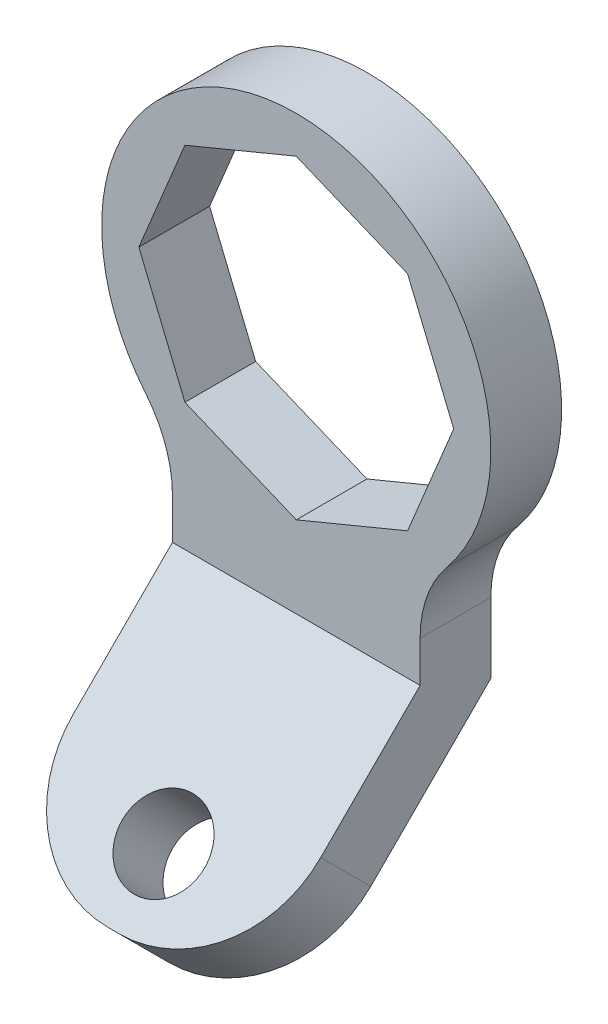
ISO-10303-21;
HEADER;
FILE_DESCRIPTION(('STEP AP214'),'2;1');
FILE_NAME('part.step','',(''),(''),'','','');
FILE_SCHEMA(('AUTOMOTIVE_DESIGN { 1 0 10303 214 1 1 1 1 }'));
ENDSEC;
DATA;
#1=APPLICATION_CONTEXT('core data for automotive mechanical design processes');
#2=APPLICATION_PROTOCOL_DEFINITION('international standard','automotive_design',2000,#1);
#3=PRODUCT_CONTEXT('',#1,'mechanical');
#4=PRODUCT('Part','Part','',(#3));
#5=PRODUCT_RELATED_PRODUCT_CATEGORY('part','',(#4));
#6=PRODUCT_DEFINITION_FORMATION('','',#4);
#7=PRODUCT_DEFINITION_CONTEXT('part definition',#1,'design');
#8=PRODUCT_DEFINITION('design','',#6,#7);
#9=PRODUCT_DEFINITION_SHAPE('','',#8);
#10=(LENGTH_UNIT() NAMED_UNIT(*) SI_UNIT(.MILLI.,.METRE.));
#11=(NAMED_UNIT(*) PLANE_ANGLE_UNIT() SI_UNIT($,.RADIAN.));
#12=(NAMED_UNIT(*) SI_UNIT($,.STERADIAN.) SOLID_ANGLE_UNIT());
#13=UNCERTAINTY_MEASURE_WITH_UNIT(LENGTH_MEASURE(1.E-05),#10,'distance_accuracy_value','');
#14=(GEOMETRIC_REPRESENTATION_CONTEXT(3) GLOBAL_UNCERTAINTY_ASSIGNED_CONTEXT((#13)) GLOBAL_UNIT_ASSIGNED_CONTEXT((#10,
#11,#12)) REPRESENTATION_CONTEXT('',''));
#15=CARTESIAN_POINT('',(0.,0.,0.));
#16=DIRECTION('',(0.,0.,1.));
#17=DIRECTION('',(1.,0.,0.));
#18=AXIS2_PLACEMENT_3D('',#15,#16,#17);
#19=CARTESIAN_POINT('',(0.,0.,6.));
#20=DIRECTION('',(0.,0.,1.));
#21=DIRECTION('',(1.,0.,0.));
#22=AXIS2_PLACEMENT_3D('',#19,#20,#21);
#23=PLANE('',#22);
#24=DIRECTION('',(0.923879532511287,-0.38268343236509,0.));
#25=VECTOR('',#24,1.);
#26=CARTESIAN_POINT('',(0.,13.35,6.));
#27=LINE('',#26,#25);
#28=CARTESIAN_POINT('',(0.,13.35,6.));
#29=VERTEX_POINT('',#28);
#30=CARTESIAN_POINT('',(9.43987552884041,9.43987552884041,6.));
#31=VERTEX_POINT('',#30);
#32=EDGE_CURVE('E232',#29,#31,#27,.T.);
#33=ORIENTED_EDGE('',*,*,#32,.T.);
#34=DIRECTION('',(0.38268343236509,-0.923879532511287,0.));
#35=VECTOR('',#34,1.);
#36=CARTESIAN_POINT('',(9.43987552884041,9.43987552884041,6.));
#37=LINE('',#36,#35);
#38=CARTESIAN_POINT('',(13.35,0.,6.));
#39=VERTEX_POINT('',#38);
#40=EDGE_CURVE('E238',#31,#39,#37,.T.);
#41=ORIENTED_EDGE('',*,*,#40,.T.);
#42=DIRECTION('',(-0.38268343236509,-0.923879532511287,0.));
#43=VECTOR('',#42,1.);
#44=CARTESIAN_POINT('',(13.35,0.,6.));
#45=LINE('',#44,#43);
#46=CARTESIAN_POINT('',(9.43987552884041,-9.43987552884041,6.));
#47=VERTEX_POINT('',#46);
#48=EDGE_CURVE('E245',#39,#47,#45,.T.);
#49=ORIENTED_EDGE('',*,*,#48,.T.);
#50=DIRECTION('',(-0.923879532511287,-0.38268343236509,0.));
#51=VECTOR('',#50,1.);
#52=CARTESIAN_POINT('',(9.43987552884041,-9.43987552884041,6.));
#53=LINE('',#52,#51);
#54=CARTESIAN_POINT('',(0.,-13.35,6.));
#55=VERTEX_POINT('',#54);
#56=EDGE_CURVE('E244',#47,#55,#53,.T.);
#57=ORIENTED_EDGE('',*,*,#56,.T.);
#58=DIRECTION('',(-0.923879532511287,0.38268343236509,0.));
#59=VECTOR('',#58,1.);
#60=CARTESIAN_POINT('',(0.,-13.35,6.));
#61=LINE('',#60,#59);
#62=CARTESIAN_POINT('',(-9.43987552884041,-9.43987552884041,6.));
#63=VERTEX_POINT('',#62);
#64=EDGE_CURVE('E247',#55,#63,#61,.T.);
#65=ORIENTED_EDGE('',*,*,#64,.T.);
#66=DIRECTION('',(-0.38268343236509,0.923879532511287,0.));
#67=VECTOR('',#66,1.);
#68=CARTESIAN_POINT('',(-9.43987552884041,-9.43987552884041,6.));
#69=LINE('',#68,#67);
#70=CARTESIAN_POINT('',(-13.35,0.,6.));
#71=VERTEX_POINT('',#70);
#72=EDGE_CURVE('E252',#63,#71,#69,.T.);
#73=ORIENTED_EDGE('',*,*,#72,.T.);
#74=DIRECTION('',(0.38268343236509,0.923879532511287,0.));
#75=VECTOR('',#74,1.);
#76=CARTESIAN_POINT('',(-13.35,0.,6.));
#77=LINE('',#76,#75);
#78=CARTESIAN_POINT('',(-9.43987552884041,9.43987552884041,6.));
#79=VERTEX_POINT('',#78);
#80=EDGE_CURVE('E251',#71,#79,#77,.T.);
#81=ORIENTED_EDGE('',*,*,#80,.T.);
#82=DIRECTION('',(0.923879532511287,0.38268343236509,0.));
#83=VECTOR('',#82,1.);
#84=CARTESIAN_POINT('',(-9.43987552884041,9.43987552884041,6.));
#85=LINE('',#84,#83);
#86=EDGE_CURVE('E260',#79,#29,#85,.T.);
#87=ORIENTED_EDGE('',*,*,#86,.T.);
#88=EDGE_LOOP('',(#33,#41,#49,#57,#65,#73,#81,#87));
#89=FACE_BOUND('',#88,.T.);
#90=DIRECTION('',(0.,1.,0.));
#91=VECTOR('',#90,1.);
#92=CARTESIAN_POINT('',(-10.5,0.,6.));
#93=LINE('',#92,#91);
#94=CARTESIAN_POINT('',(-10.5,-20.2573593128806,6.));
#95=VERTEX_POINT('',#94);
#96=CARTESIAN_POINT('',(-10.5,-16.7928556237467,6.));
#97=VERTEX_POINT('',#96);
#98=EDGE_CURVE('E228',#95,#97,#93,.T.);
#99=ORIENTED_EDGE('',*,*,#98,.F.);
#100=DIRECTION('',(1.,0.,0.));
#101=VECTOR('',#100,1.);
#102=CARTESIAN_POINT('',(-15.7928932188136,-20.2573593128806,6.));
#103=LINE('',#102,#101);
#104=CARTESIAN_POINT('',(10.5,-20.2573593128806,6.));
#105=VERTEX_POINT('',#104);
#106=EDGE_CURVE('E218',#95,#105,#103,.T.);
#107=ORIENTED_EDGE('',*,*,#106,.T.);
#108=DIRECTION('',(0.,1.,0.));
#109=VECTOR('',#108,1.);
#110=CARTESIAN_POINT('',(10.5,0.,6.));
#111=LINE('',#110,#109);
#112=CARTESIAN_POINT('',(10.5,-16.7928556237467,6.));
#113=VERTEX_POINT('',#112);
#114=EDGE_CURVE('E229',#105,#113,#111,.T.);
#115=ORIENTED_EDGE('',*,*,#114,.T.);
#116=CARTESIAN_POINT('',(20.5,-16.7928556237467,6.));
#117=DIRECTION('',(0.,0.,1.));
#118=DIRECTION('',(1.,0.,0.));
#119=AXIS2_PLACEMENT_3D('',#116,#117,#118);
#120=CIRCLE('',#119,10.);
#121=CARTESIAN_POINT('',(12.7641509433962,-10.4559289732762,6.));
#122=VERTEX_POINT('',#121);
#123=EDGE_CURVE('E328',#113,#122,#120,.F.);
#124=ORIENTED_EDGE('',*,*,#123,.T.);
#125=CARTESIAN_POINT('',(0.,0.,6.));
#126=DIRECTION('',(0.,0.,1.));
#127=DIRECTION('',(1.,0.,0.));
#128=AXIS2_PLACEMENT_3D('',#125,#126,#127);
#129=CIRCLE('',#128,16.5);
#130=CARTESIAN_POINT('',(-12.7641509433962,-10.4559289732762,6.));
#131=VERTEX_POINT('',#130);
#132=EDGE_CURVE('E300',#122,#131,#129,.T.);
#133=ORIENTED_EDGE('',*,*,#132,.T.);
#134=CARTESIAN_POINT('',(-20.5,-16.7928556237467,6.));
#135=DIRECTION('',(0.,0.,1.));
#136=DIRECTION('',(1.,0.,0.));
#137=AXIS2_PLACEMENT_3D('',#134,#135,#136);
#138=CIRCLE('',#137,10.);
#139=EDGE_CURVE('E78',#131,#97,#138,.F.);
#140=ORIENTED_EDGE('',*,*,#139,.T.);
#141=EDGE_LOOP('',(#99,#107,#115,#124,#133,#140));
#142=FACE_BOUND('',#141,.T.);
#143=ADVANCED_FACE('F74',(#89,#142),#23,.T.);
#144=CARTESIAN_POINT('',(0.,0.,0.));
#145=DIRECTION('',(0.,0.,1.));
#146=DIRECTION('',(1.,0.,0.));
#147=AXIS2_PLACEMENT_3D('',#144,#145,#146);
#148=PLANE('',#147);
#149=DIRECTION('',(0.38268343236509,-0.923879532511287,0.));
#150=VECTOR('',#149,1.);
#151=CARTESIAN_POINT('',(9.43987552884041,9.43987552884041,0.));
#152=LINE('',#151,#150);
#153=CARTESIAN_POINT('',(9.43987552884041,9.43987552884041,0.));
#154=VERTEX_POINT('',#153);
#155=CARTESIAN_POINT('',(13.35,0.,0.));
#156=VERTEX_POINT('',#155);
#157=EDGE_CURVE('E225',#154,#156,#152,.T.);
#158=ORIENTED_EDGE('',*,*,#157,.F.);
#159=DIRECTION('',(0.923879532511287,-0.38268343236509,0.));
#160=VECTOR('',#159,1.);
#161=CARTESIAN_POINT('',(0.,13.35,0.));
#162=LINE('',#161,#160);
#163=CARTESIAN_POINT('',(0.,13.35,0.));
#164=VERTEX_POINT('',#163);
#165=EDGE_CURVE('E224',#164,#154,#162,.T.);
#166=ORIENTED_EDGE('',*,*,#165,.F.);
#167=DIRECTION('',(0.923879532511287,0.38268343236509,0.));
#168=VECTOR('',#167,1.);
#169=CARTESIAN_POINT('',(-9.43987552884041,9.43987552884041,0.));
#170=LINE('',#169,#168);
#171=CARTESIAN_POINT('',(-9.43987552884041,9.43987552884041,0.));
#172=VERTEX_POINT('',#171);
#173=EDGE_CURVE('E237',#172,#164,#170,.T.);
#174=ORIENTED_EDGE('',*,*,#173,.F.);
#175=DIRECTION('',(0.38268343236509,0.923879532511287,0.));
#176=VECTOR('',#175,1.);
#177=CARTESIAN_POINT('',(-13.35,0.,0.));
#178=LINE('',#177,#176);
#179=CARTESIAN_POINT('',(-13.35,0.,0.));
#180=VERTEX_POINT('',#179);
#181=EDGE_CURVE('E273',#180,#172,#178,.T.);
#182=ORIENTED_EDGE('',*,*,#181,.F.);
#183=DIRECTION('',(-0.38268343236509,0.923879532511287,0.));
#184=VECTOR('',#183,1.);
#185=CARTESIAN_POINT('',(-9.43987552884041,-9.43987552884041,0.));
#186=LINE('',#185,#184);
#187=CARTESIAN_POINT('',(-9.43987552884041,-9.43987552884041,0.));
#188=VERTEX_POINT('',#187);
#189=EDGE_CURVE('E275',#188,#180,#186,.T.);
#190=ORIENTED_EDGE('',*,*,#189,.F.);
#191=DIRECTION('',(-0.923879532511287,0.38268343236509,0.));
#192=VECTOR('',#191,1.);
#193=CARTESIAN_POINT('',(0.,-13.35,0.));
#194=LINE('',#193,#192);
#195=CARTESIAN_POINT('',(0.,-13.35,0.));
#196=VERTEX_POINT('',#195);
#197=EDGE_CURVE('E270',#196,#188,#194,.T.);
#198=ORIENTED_EDGE('',*,*,#197,.F.);
#199=DIRECTION('',(-0.923879532511287,-0.38268343236509,0.));
#200=VECTOR('',#199,1.);
#201=CARTESIAN_POINT('',(9.43987552884041,-9.43987552884041,0.));
#202=LINE('',#201,#200);
#203=CARTESIAN_POINT('',(9.43987552884041,-9.43987552884041,0.));
#204=VERTEX_POINT('',#203);
#205=EDGE_CURVE('E268',#204,#196,#202,.T.);
#206=ORIENTED_EDGE('',*,*,#205,.F.);
#207=DIRECTION('',(-0.38268343236509,-0.923879532511287,0.));
#208=VECTOR('',#207,1.);
#209=CARTESIAN_POINT('',(13.35,0.,0.));
#210=LINE('',#209,#208);
#211=EDGE_CURVE('E262',#156,#204,#210,.T.);
#212=ORIENTED_EDGE('',*,*,#211,.F.);
#213=EDGE_LOOP('',(#158,#166,#174,#182,#190,#198,#206,#212));
#214=FACE_BOUND('',#213,.T.);
#215=DIRECTION('',(1.,0.,0.));
#216=VECTOR('',#215,1.);
#217=CARTESIAN_POINT('',(-16.5,-22.7426406871192,0.));
#218=LINE('',#217,#216);
#219=CARTESIAN_POINT('',(-10.5,-22.7426406871192,0.));
#220=VERTEX_POINT('',#219);
#221=CARTESIAN_POINT('',(10.5,-22.7426406871192,0.));
#222=VERTEX_POINT('',#221);
#223=EDGE_CURVE('E204',#220,#222,#218,.T.);
#224=ORIENTED_EDGE('',*,*,#223,.F.);
#225=DIRECTION('',(0.,1.,0.));
#226=VECTOR('',#225,1.);
#227=CARTESIAN_POINT('',(-10.5,0.,0.));
#228=LINE('',#227,#226);
#229=CARTESIAN_POINT('',(-10.5,-16.7928556237467,0.));
#230=VERTEX_POINT('',#229);
#231=EDGE_CURVE('E215',#220,#230,#228,.T.);
#232=ORIENTED_EDGE('',*,*,#231,.T.);
#233=CARTESIAN_POINT('',(-20.5,-16.7928556237467,0.));
#234=DIRECTION('',(0.,0.,1.));
#235=DIRECTION('',(1.,0.,0.));
#236=AXIS2_PLACEMENT_3D('',#233,#234,#235);
#237=CIRCLE('',#236,10.);
#238=CARTESIAN_POINT('',(-12.7641509433962,-10.4559289732762,0.));
#239=VERTEX_POINT('',#238);
#240=EDGE_CURVE('E12',#230,#239,#237,.T.);
#241=ORIENTED_EDGE('',*,*,#240,.T.);
#242=CARTESIAN_POINT('',(0.,0.,0.));
#243=DIRECTION('',(0.,0.,1.));
#244=DIRECTION('',(1.,0.,0.));
#245=AXIS2_PLACEMENT_3D('',#242,#243,#244);
#246=CIRCLE('',#245,16.5);
#247=CARTESIAN_POINT('',(12.7641509433962,-10.4559289732762,0.));
#248=VERTEX_POINT('',#247);
#249=EDGE_CURVE('E284',#248,#239,#246,.T.);
#250=ORIENTED_EDGE('',*,*,#249,.F.);
#251=CARTESIAN_POINT('',(20.5,-16.7928556237467,0.));
#252=DIRECTION('',(0.,0.,1.));
#253=DIRECTION('',(1.,0.,0.));
#254=AXIS2_PLACEMENT_3D('',#251,#252,#253);
#255=CIRCLE('',#254,10.);
#256=CARTESIAN_POINT('',(10.5,-16.7928556237467,0.));
#257=VERTEX_POINT('',#256);
#258=EDGE_CURVE('E327',#248,#257,#255,.T.);
#259=ORIENTED_EDGE('',*,*,#258,.T.);
#260=DIRECTION('',(0.,1.,0.));
#261=VECTOR('',#260,1.);
#262=CARTESIAN_POINT('',(10.5,0.,0.));
#263=LINE('',#262,#261);
#264=EDGE_CURVE('E211',#222,#257,#263,.T.);
#265=ORIENTED_EDGE('',*,*,#264,.F.);
#266=EDGE_LOOP('',(#224,#232,#241,#250,#259,#265));
#267=FACE_BOUND('',#266,.T.);
#268=ADVANCED_FACE('F212',(#214,#267),#148,.F.);
#269=CARTESIAN_POINT('',(-10.5,0.,0.));
#270=DIRECTION('',(1.,0.,0.));
#271=DIRECTION('',(0.,0.,-1.));
#272=AXIS2_PLACEMENT_3D('',#269,#270,#271);
#273=PLANE('',#272);
#274=DIRECTION('',(0.,0.707106781186551,-0.707106781186544));
#275=VECTOR('',#274,1.);
#276=CARTESIAN_POINT('',(-10.5,-11.3713203435594,-11.3713203435596));
#277=LINE('',#276,#275);
#278=CARTESIAN_POINT('',(-10.5,-32.9289321881345,10.1862915010153));
#279=VERTEX_POINT('',#278);
#280=EDGE_CURVE('E199',#279,#220,#277,.T.);
#281=ORIENTED_EDGE('',*,*,#280,.F.);
#282=DIRECTION('',(0.,-0.707106781186544,-0.707106781186551));
#283=VECTOR('',#282,1.);
#284=CARTESIAN_POINT('',(-10.5,-28.6862915010152,14.4289321881346));
#285=LINE('',#284,#283);
#286=CARTESIAN_POINT('',(-10.5,-28.6862915010152,14.4289321881346));
#287=VERTEX_POINT('',#286);
#288=EDGE_CURVE('E309',#279,#287,#285,.F.);
#289=ORIENTED_EDGE('',*,*,#288,.T.);
#290=DIRECTION('',(0.,-0.707106781186551,0.707106781186544));
#291=VECTOR('',#290,1.);
#292=CARTESIAN_POINT('',(-10.5,-7.12867965644019,-7.12867965644026));
#293=LINE('',#292,#291);
#294=EDGE_CURVE('E209',#95,#287,#293,.T.);
#295=ORIENTED_EDGE('',*,*,#294,.F.);
#296=ORIENTED_EDGE('',*,*,#98,.T.);
#297=DIRECTION('',(0.,0.,1.));
#298=VECTOR('',#297,1.);
#299=CARTESIAN_POINT('',(-10.5,-16.7928556237467,0.));
#300=LINE('',#299,#298);
#301=EDGE_CURVE('E223',#97,#230,#300,.F.);
#302=ORIENTED_EDGE('',*,*,#301,.T.);
#303=ORIENTED_EDGE('',*,*,#231,.F.);
#304=EDGE_LOOP('',(#281,#289,#295,#296,#302,#303));
#305=FACE_BOUND('',#304,.T.);
#306=ADVANCED_FACE('F217',(#305),#273,.F.);
#307=CARTESIAN_POINT('',(10.5,0.,0.));
#308=DIRECTION('',(1.,0.,0.));
#309=DIRECTION('',(0.,0.,-1.));
#310=AXIS2_PLACEMENT_3D('',#307,#308,#309);
#311=PLANE('',#310);
#312=DIRECTION('',(0.,-0.707106781186551,0.707106781186544));
#313=VECTOR('',#312,1.);
#314=CARTESIAN_POINT('',(10.5,-7.12867965644019,-7.12867965644026));
#315=LINE('',#314,#313);
#316=CARTESIAN_POINT('',(10.5,-28.6862915010152,14.4289321881346));
#317=VERTEX_POINT('',#316);
#318=EDGE_CURVE('E352',#105,#317,#315,.T.);
#319=ORIENTED_EDGE('',*,*,#318,.T.);
#320=DIRECTION('',(0.,-0.707106781186544,-0.707106781186551));
#321=VECTOR('',#320,1.);
#322=CARTESIAN_POINT('',(10.5,-21.557611844575,21.5576118445748));
#323=LINE('',#322,#321);
#324=CARTESIAN_POINT('',(10.5,-32.9289321881345,10.1862915010153));
#325=VERTEX_POINT('',#324);
#326=EDGE_CURVE('E316',#317,#325,#323,.T.);
#327=ORIENTED_EDGE('',*,*,#326,.T.);
#328=DIRECTION('',(0.,0.707106781186551,-0.707106781186544));
#329=VECTOR('',#328,1.);
#330=CARTESIAN_POINT('',(10.5,-11.3713203435594,-11.3713203435596));
#331=LINE('',#330,#329);
#332=EDGE_CURVE('E355',#325,#222,#331,.T.);
#333=ORIENTED_EDGE('',*,*,#332,.T.);
#334=ORIENTED_EDGE('',*,*,#264,.T.);
#335=DIRECTION('',(0.,0.,-1.));
#336=VECTOR('',#335,1.);
#337=CARTESIAN_POINT('',(10.5,-16.7928556237467,0.));
#338=LINE('',#337,#336);
#339=EDGE_CURVE('E317',#257,#113,#338,.F.);
#340=ORIENTED_EDGE('',*,*,#339,.T.);
#341=ORIENTED_EDGE('',*,*,#114,.F.);
#342=EDGE_LOOP('',(#319,#327,#333,#334,#340,#341));
#343=FACE_BOUND('',#342,.T.);
#344=ADVANCED_FACE('F341',(#343),#311,.T.);
#345=CARTESIAN_POINT('',(0.,0.,6.));
#346=DIRECTION('',(0.,0.,-1.));
#347=DIRECTION('',(-1.,0.,0.));
#348=AXIS2_PLACEMENT_3D('',#345,#346,#347);
#349=CYLINDRICAL_SURFACE('',#348,16.5);
#350=ORIENTED_EDGE('',*,*,#132,.F.);
#351=DIRECTION('',(0.,0.,-1.));
#352=VECTOR('',#351,1.);
#353=CARTESIAN_POINT('',(12.7641509433962,-10.4559289732762,6.));
#354=LINE('',#353,#352);
#355=EDGE_CURVE('E94',#122,#248,#354,.T.);
#356=ORIENTED_EDGE('',*,*,#355,.T.);
#357=ORIENTED_EDGE('',*,*,#249,.T.);
#358=DIRECTION('',(0.,0.,-1.));
#359=VECTOR('',#358,1.);
#360=CARTESIAN_POINT('',(-12.7641509433962,-10.4559289732762,6.));
#361=LINE('',#360,#359);
#362=EDGE_CURVE('E325',#239,#131,#361,.F.);
#363=ORIENTED_EDGE('',*,*,#362,.T.);
#364=EDGE_LOOP('',(#350,#356,#357,#363));
#365=FACE_BOUND('',#364,.T.);
#366=ADVANCED_FACE('F337',(#365),#349,.T.);
#367=CARTESIAN_POINT('',(0.,13.35,6.));
#368=DIRECTION('',(0.38268343236509,0.923879532511287,0.));
#369=DIRECTION('',(-0.923879532511287,0.38268343236509,0.));
#370=AXIS2_PLACEMENT_3D('',#367,#368,#369);
#371=PLANE('',#370);
#372=ORIENTED_EDGE('',*,*,#165,.T.);
#373=DIRECTION('',(0.,0.,-1.));
#374=VECTOR('',#373,1.);
#375=CARTESIAN_POINT('',(9.43987552884041,9.43987552884041,6.));
#376=LINE('',#375,#374);
#377=EDGE_CURVE('E256',#31,#154,#376,.T.);
#378=ORIENTED_EDGE('',*,*,#377,.F.);
#379=ORIENTED_EDGE('',*,*,#32,.F.);
#380=DIRECTION('',(0.,0.,-1.));
#381=VECTOR('',#380,1.);
#382=CARTESIAN_POINT('',(0.,13.35,6.));
#383=LINE('',#382,#381);
#384=EDGE_CURVE('E278',#29,#164,#383,.T.);
#385=ORIENTED_EDGE('',*,*,#384,.T.);
#386=EDGE_LOOP('',(#372,#378,#379,#385));
#387=FACE_BOUND('',#386,.T.);
#388=ADVANCED_FACE('F395',(#387),#371,.F.);
#389=CARTESIAN_POINT('',(-9.43987552884041,9.43987552884041,6.));
#390=DIRECTION('',(-0.38268343236509,0.923879532511287,0.));
#391=DIRECTION('',(-0.923879532511287,-0.38268343236509,0.));
#392=AXIS2_PLACEMENT_3D('',#389,#390,#391);
#393=PLANE('',#392);
#394=ORIENTED_EDGE('',*,*,#173,.T.);
#395=ORIENTED_EDGE('',*,*,#384,.F.);
#396=ORIENTED_EDGE('',*,*,#86,.F.);
#397=DIRECTION('',(0.,0.,-1.));
#398=VECTOR('',#397,1.);
#399=CARTESIAN_POINT('',(-9.43987552884041,9.43987552884041,6.));
#400=LINE('',#399,#398);
#401=EDGE_CURVE('E282',#79,#172,#400,.T.);
#402=ORIENTED_EDGE('',*,*,#401,.T.);
#403=EDGE_LOOP('',(#394,#395,#396,#402));
#404=FACE_BOUND('',#403,.T.);
#405=ADVANCED_FACE('F405',(#404),#393,.F.);
#406=CARTESIAN_POINT('',(-13.35,0.,6.));
#407=DIRECTION('',(-0.923879532511287,0.38268343236509,0.));
#408=DIRECTION('',(-0.38268343236509,-0.923879532511287,0.));
#409=AXIS2_PLACEMENT_3D('',#406,#407,#408);
#410=PLANE('',#409);
#411=ORIENTED_EDGE('',*,*,#181,.T.);
#412=ORIENTED_EDGE('',*,*,#401,.F.);
#413=ORIENTED_EDGE('',*,*,#80,.F.);
#414=DIRECTION('',(0.,0.,-1.));
#415=VECTOR('',#414,1.);
#416=CARTESIAN_POINT('',(-13.35,0.,6.));
#417=LINE('',#416,#415);
#418=EDGE_CURVE('E281',#71,#180,#417,.T.);
#419=ORIENTED_EDGE('',*,*,#418,.T.);
#420=EDGE_LOOP('',(#411,#412,#413,#419));
#421=FACE_BOUND('',#420,.T.);
#422=ADVANCED_FACE('F412',(#421),#410,.F.);
#423=CARTESIAN_POINT('',(-9.43987552884041,-9.43987552884041,6.));
#424=DIRECTION('',(-0.923879532511287,-0.38268343236509,0.));
#425=DIRECTION('',(0.38268343236509,-0.923879532511287,0.));
#426=AXIS2_PLACEMENT_3D('',#423,#424,#425);
#427=PLANE('',#426);
#428=ORIENTED_EDGE('',*,*,#189,.T.);
#429=ORIENTED_EDGE('',*,*,#418,.F.);
#430=ORIENTED_EDGE('',*,*,#72,.F.);
#431=DIRECTION('',(0.,0.,-1.));
#432=VECTOR('',#431,1.);
#433=CARTESIAN_POINT('',(-9.43987552884041,-9.43987552884041,6.));
#434=LINE('',#433,#432);
#435=EDGE_CURVE('E289',#63,#188,#434,.T.);
#436=ORIENTED_EDGE('',*,*,#435,.T.);
#437=EDGE_LOOP('',(#428,#429,#430,#436));
#438=FACE_BOUND('',#437,.T.);
#439=ADVANCED_FACE('F419',(#438),#427,.F.);
#440=CARTESIAN_POINT('',(0.,-13.35,6.));
#441=DIRECTION('',(-0.38268343236509,-0.923879532511287,0.));
#442=DIRECTION('',(0.923879532511287,-0.38268343236509,0.));
#443=AXIS2_PLACEMENT_3D('',#440,#441,#442);
#444=PLANE('',#443);
#445=ORIENTED_EDGE('',*,*,#197,.T.);
#446=ORIENTED_EDGE('',*,*,#435,.F.);
#447=ORIENTED_EDGE('',*,*,#64,.F.);
#448=DIRECTION('',(0.,0.,-1.));
#449=VECTOR('',#448,1.);
#450=CARTESIAN_POINT('',(0.,-13.35,6.));
#451=LINE('',#450,#449);
#452=EDGE_CURVE('E290',#55,#196,#451,.T.);
#453=ORIENTED_EDGE('',*,*,#452,.T.);
#454=EDGE_LOOP('',(#445,#446,#447,#453));
#455=FACE_BOUND('',#454,.T.);
#456=ADVANCED_FACE('F423',(#455),#444,.F.);
#457=CARTESIAN_POINT('',(9.43987552884041,-9.43987552884041,6.));
#458=DIRECTION('',(0.38268343236509,-0.923879532511287,0.));
#459=DIRECTION('',(0.923879532511287,0.38268343236509,0.));
#460=AXIS2_PLACEMENT_3D('',#457,#458,#459);
#461=PLANE('',#460);
#462=ORIENTED_EDGE('',*,*,#205,.T.);
#463=ORIENTED_EDGE('',*,*,#452,.F.);
#464=ORIENTED_EDGE('',*,*,#56,.F.);
#465=DIRECTION('',(0.,0.,-1.));
#466=VECTOR('',#465,1.);
#467=CARTESIAN_POINT('',(9.43987552884041,-9.43987552884041,6.));
#468=LINE('',#467,#466);
#469=EDGE_CURVE('E293',#47,#204,#468,.T.);
#470=ORIENTED_EDGE('',*,*,#469,.T.);
#471=EDGE_LOOP('',(#462,#463,#464,#470));
#472=FACE_BOUND('',#471,.T.);
#473=ADVANCED_FACE('F424',(#472),#461,.F.);
#474=CARTESIAN_POINT('',(13.35,0.,6.));
#475=DIRECTION('',(0.923879532511287,-0.38268343236509,0.));
#476=DIRECTION('',(0.38268343236509,0.923879532511287,0.));
#477=AXIS2_PLACEMENT_3D('',#474,#475,#476);
#478=PLANE('',#477);
#479=ORIENTED_EDGE('',*,*,#211,.T.);
#480=ORIENTED_EDGE('',*,*,#469,.F.);
#481=ORIENTED_EDGE('',*,*,#48,.F.);
#482=DIRECTION('',(0.,0.,-1.));
#483=VECTOR('',#482,1.);
#484=CARTESIAN_POINT('',(13.35,0.,6.));
#485=LINE('',#484,#483);
#486=EDGE_CURVE('E291',#39,#156,#485,.T.);
#487=ORIENTED_EDGE('',*,*,#486,.T.);
#488=EDGE_LOOP('',(#479,#480,#481,#487));
#489=FACE_BOUND('',#488,.T.);
#490=ADVANCED_FACE('F429',(#489),#478,.F.);
#491=CARTESIAN_POINT('',(9.43987552884041,9.43987552884041,6.));
#492=DIRECTION('',(0.923879532511287,0.38268343236509,0.));
#493=DIRECTION('',(-0.38268343236509,0.923879532511287,0.));
#494=AXIS2_PLACEMENT_3D('',#491,#492,#493);
#495=PLANE('',#494);
#496=ORIENTED_EDGE('',*,*,#157,.T.);
#497=ORIENTED_EDGE('',*,*,#486,.F.);
#498=ORIENTED_EDGE('',*,*,#40,.F.);
#499=ORIENTED_EDGE('',*,*,#377,.T.);
#500=EDGE_LOOP('',(#496,#497,#498,#499));
#501=FACE_BOUND('',#500,.T.);
#502=ADVANCED_FACE('F435',(#501),#495,.F.);
#503=CARTESIAN_POINT('',(-10.5,-11.3713203435594,-11.3713203435596));
#504=DIRECTION('',(0.,-0.707106781186544,-0.707106781186551));
#505=DIRECTION('',(0.,0.707106781186551,-0.707106781186544));
#506=AXIS2_PLACEMENT_3D('',#503,#504,#505);
#507=PLANE('',#506);
#508=CARTESIAN_POINT('',(0.,-35.7573593128807,13.0147186257614));
#509=DIRECTION('',(0.,-0.707106781186544,-0.707106781186551));
#510=DIRECTION('',(0.,0.707106781186551,-0.707106781186544));
#511=AXIS2_PLACEMENT_3D('',#508,#509,#510);
#512=CIRCLE('',#511,3.5);
#513=CARTESIAN_POINT('',(0.,-33.2824855787278,10.5398448916085));
#514=VERTEX_POINT('',#513);
#515=EDGE_CURVE('E346',#514,#514,#512,.T.);
#516=ORIENTED_EDGE('',*,*,#515,.F.);
#517=EDGE_LOOP('',(#516));
#518=FACE_BOUND('',#517,.T.);
#519=DIRECTION('',(1.,0.,0.));
#520=VECTOR('',#519,1.);
#521=CARTESIAN_POINT('',(-10.5,-40.,17.2573593128807));
#522=LINE('',#521,#520);
#523=CARTESIAN_POINT('',(-0.500000000000002,-40.,17.2573593128807));
#524=VERTEX_POINT('',#523);
#525=CARTESIAN_POINT('',(0.499999999999999,-40.,17.2573593128807));
#526=VERTEX_POINT('',#525);
#527=EDGE_CURVE('E231',#524,#526,#522,.T.);
#528=ORIENTED_EDGE('',*,*,#527,.F.);
#529=CARTESIAN_POINT('',(-0.499999999999999,-32.9289321881345,10.1862915010153));
#530=DIRECTION('',(0.,-0.707106781186544,-0.707106781186551));
#531=DIRECTION('',(0.,0.707106781186551,-0.707106781186544));
#532=AXIS2_PLACEMENT_3D('',#529,#530,#531);
#533=CIRCLE('',#532,10.);
#534=EDGE_CURVE('E205',#524,#279,#533,.T.);
#535=ORIENTED_EDGE('',*,*,#534,.T.);
#536=ORIENTED_EDGE('',*,*,#280,.T.);
#537=ORIENTED_EDGE('',*,*,#223,.T.);
#538=ORIENTED_EDGE('',*,*,#332,.F.);
#539=CARTESIAN_POINT('',(0.500000000000002,-32.9289321881345,10.1862915010153));
#540=DIRECTION('',(0.,-0.707106781186544,-0.707106781186551));
#541=DIRECTION('',(0.,0.707106781186551,-0.707106781186544));
#542=AXIS2_PLACEMENT_3D('',#539,#540,#541);
#543=CIRCLE('',#542,10.);
#544=EDGE_CURVE('E306',#325,#526,#543,.T.);
#545=ORIENTED_EDGE('',*,*,#544,.T.);
#546=EDGE_LOOP('',(#528,#535,#536,#537,#538,#545));
#547=FACE_BOUND('',#546,.T.);
#548=ADVANCED_FACE('F196',(#518,#547),#507,.T.);
#549=CARTESIAN_POINT('',(-10.5,-28.6286796564405,28.6286796564403));
#550=DIRECTION('',(0.,-0.707106781186551,0.707106781186544));
#551=DIRECTION('',(0.,-0.707106781186544,-0.707106781186551));
#552=AXIS2_PLACEMENT_3D('',#549,#550,#551);
#553=PLANE('',#552);
#554=DIRECTION('',(1.,0.,0.));
#555=VECTOR('',#554,1.);
#556=CARTESIAN_POINT('',(-10.5,-35.7573593128807,21.5));
#557=LINE('',#556,#555);
#558=CARTESIAN_POINT('',(-0.500000000000002,-35.7573593128807,21.5));
#559=VERTEX_POINT('',#558);
#560=CARTESIAN_POINT('',(0.499999999999999,-35.7573593128807,21.5));
#561=VERTEX_POINT('',#560);
#562=EDGE_CURVE('E206',#559,#561,#557,.T.);
#563=ORIENTED_EDGE('',*,*,#562,.F.);
#564=DIRECTION('',(0.,-0.707106781186544,-0.707106781186551));
#565=VECTOR('',#564,1.);
#566=CARTESIAN_POINT('',(-0.499999999999999,-40.,17.2573593128807));
#567=LINE('',#566,#565);
#568=EDGE_CURVE('E303',#559,#524,#567,.T.);
#569=ORIENTED_EDGE('',*,*,#568,.T.);
#570=ORIENTED_EDGE('',*,*,#527,.T.);
#571=DIRECTION('',(0.,-0.707106781186544,-0.707106781186551));
#572=VECTOR('',#571,1.);
#573=CARTESIAN_POINT('',(0.500000000000002,-28.6286796564405,28.6286796564403));
#574=LINE('',#573,#572);
#575=EDGE_CURVE('E297',#526,#561,#574,.F.);
#576=ORIENTED_EDGE('',*,*,#575,.T.);
#577=EDGE_LOOP('',(#563,#569,#570,#576));
#578=FACE_BOUND('',#577,.T.);
#579=ADVANCED_FACE('F369',(#578),#553,.T.);
#580=CARTESIAN_POINT('',(-10.5,-7.12867965644019,-7.12867965644026));
#581=DIRECTION('',(0.,0.707106781186544,0.707106781186551));
#582=DIRECTION('',(0.,-0.707106781186551,0.707106781186544));
#583=AXIS2_PLACEMENT_3D('',#580,#581,#582);
#584=PLANE('',#583);
#585=CARTESIAN_POINT('',(0.,-31.5147186257614,17.2573593128807));
#586=DIRECTION('',(0.,0.707106781186544,0.707106781186551));
#587=DIRECTION('',(0.,-0.707106781186551,0.707106781186544));
#588=AXIS2_PLACEMENT_3D('',#585,#586,#587);
#589=CIRCLE('',#588,3.5);
#590=CARTESIAN_POINT('',(0.,-33.9895923599144,19.7322330470336));
#591=VERTEX_POINT('',#590);
#592=EDGE_CURVE('E213',#591,#591,#589,.T.);
#593=ORIENTED_EDGE('',*,*,#592,.F.);
#594=EDGE_LOOP('',(#593));
#595=FACE_BOUND('',#594,.T.);
#596=ORIENTED_EDGE('',*,*,#294,.T.);
#597=CARTESIAN_POINT('',(-0.499999999999999,-28.6862915010152,14.4289321881346));
#598=DIRECTION('',(0.,0.707106781186544,0.707106781186551));
#599=DIRECTION('',(0.,-0.707106781186551,0.707106781186544));
#600=AXIS2_PLACEMENT_3D('',#597,#598,#599);
#601=CIRCLE('',#600,10.);
#602=EDGE_CURVE('E313',#287,#559,#601,.T.);
#603=ORIENTED_EDGE('',*,*,#602,.T.);
#604=ORIENTED_EDGE('',*,*,#562,.T.);
#605=CARTESIAN_POINT('',(0.500000000000002,-28.6862915010152,14.4289321881346));
#606=DIRECTION('',(0.,0.707106781186544,0.707106781186551));
#607=DIRECTION('',(0.,-0.707106781186551,0.707106781186544));
#608=AXIS2_PLACEMENT_3D('',#605,#606,#607);
#609=CIRCLE('',#608,10.);
#610=EDGE_CURVE('E315',#561,#317,#609,.T.);
#611=ORIENTED_EDGE('',*,*,#610,.T.);
#612=ORIENTED_EDGE('',*,*,#318,.F.);
#613=ORIENTED_EDGE('',*,*,#106,.F.);
#614=EDGE_LOOP('',(#596,#603,#604,#611,#612,#613));
#615=FACE_BOUND('',#614,.T.);
#616=ADVANCED_FACE('F365',(#595,#615),#584,.T.);
#617=CARTESIAN_POINT('',(0.,-44.386038969321,4.38603896932099));
#618=DIRECTION('',(0.,0.707106781186544,0.707106781186551));
#619=DIRECTION('',(0.,-0.707106781186551,0.707106781186544));
#620=AXIS2_PLACEMENT_3D('',#617,#618,#619);
#621=CYLINDRICAL_SURFACE('',#620,3.5);
#622=ORIENTED_EDGE('',*,*,#515,.T.);
#623=EDGE_LOOP('',(#622));
#624=FACE_BOUND('',#623,.T.);
#625=ORIENTED_EDGE('',*,*,#592,.T.);
#626=EDGE_LOOP('',(#625));
#627=FACE_BOUND('',#626,.T.);
#628=ADVANCED_FACE('F372',(#624,#627),#621,.F.);
#629=CARTESIAN_POINT('',(-0.499999999999999,-21.557611844575,21.5576118445748));
#630=DIRECTION('',(0.,0.707106781186544,0.707106781186551));
#631=DIRECTION('',(0.,-0.707106781186551,0.707106781186544));
#632=AXIS2_PLACEMENT_3D('',#629,#630,#631);
#633=CYLINDRICAL_SURFACE('',#632,10.);
#634=ORIENTED_EDGE('',*,*,#602,.F.);
#635=ORIENTED_EDGE('',*,*,#288,.F.);
#636=ORIENTED_EDGE('',*,*,#534,.F.);
#637=ORIENTED_EDGE('',*,*,#568,.F.);
#638=EDGE_LOOP('',(#634,#635,#636,#637));
#639=FACE_BOUND('',#638,.T.);
#640=ADVANCED_FACE('F375',(#639),#633,.T.);
#641=CARTESIAN_POINT('',(0.500000000000002,-21.557611844575,21.5576118445748));
#642=DIRECTION('',(0.,-0.707106781186544,-0.707106781186551));
#643=DIRECTION('',(0.,0.707106781186551,-0.707106781186544));
#644=AXIS2_PLACEMENT_3D('',#641,#642,#643);
#645=CYLINDRICAL_SURFACE('',#644,10.);
#646=ORIENTED_EDGE('',*,*,#610,.F.);
#647=ORIENTED_EDGE('',*,*,#575,.F.);
#648=ORIENTED_EDGE('',*,*,#544,.F.);
#649=ORIENTED_EDGE('',*,*,#326,.F.);
#650=EDGE_LOOP('',(#646,#647,#648,#649));
#651=FACE_BOUND('',#650,.T.);
#652=ADVANCED_FACE('F367',(#651),#645,.T.);
#653=CARTESIAN_POINT('',(20.5,-16.7928556237467,6.));
#654=DIRECTION('',(0.,0.,-1.));
#655=DIRECTION('',(-1.,0.,0.));
#656=AXIS2_PLACEMENT_3D('',#653,#654,#655);
#657=CYLINDRICAL_SURFACE('',#656,10.);
#658=ORIENTED_EDGE('',*,*,#258,.F.);
#659=ORIENTED_EDGE('',*,*,#355,.F.);
#660=ORIENTED_EDGE('',*,*,#123,.F.);
#661=ORIENTED_EDGE('',*,*,#339,.F.);
#662=EDGE_LOOP('',(#658,#659,#660,#661));
#663=FACE_BOUND('',#662,.T.);
#664=ADVANCED_FACE('F338',(#663),#657,.F.);
#665=CARTESIAN_POINT('',(-20.5,-16.7928556237467,6.));
#666=DIRECTION('',(0.,0.,-1.));
#667=DIRECTION('',(-1.,0.,0.));
#668=AXIS2_PLACEMENT_3D('',#665,#666,#667);
#669=CYLINDRICAL_SURFACE('',#668,10.);
#670=ORIENTED_EDGE('',*,*,#240,.F.);
#671=ORIENTED_EDGE('',*,*,#301,.F.);
#672=ORIENTED_EDGE('',*,*,#139,.F.);
#673=ORIENTED_EDGE('',*,*,#362,.F.);
#674=EDGE_LOOP('',(#670,#671,#672,#673));
#675=FACE_BOUND('',#674,.T.);
#676=ADVANCED_FACE('F75',(#675),#669,.F.);
#677=CLOSED_SHELL('',(#143,#268,#306,#344,#366,#388,#405,#422,#439,#456,#473,#490,#502,#548,
#579,#616,#628,#640,#652,#664,#676));
#678=MANIFOLD_SOLID_BREP('B2',#677);
#679=ADVANCED_BREP_SHAPE_REPRESENTATION('',(#18,#678),#14);
#680=SHAPE_DEFINITION_REPRESENTATION(#9,#679);
ENDSEC;
END-ISO-10303-21;
